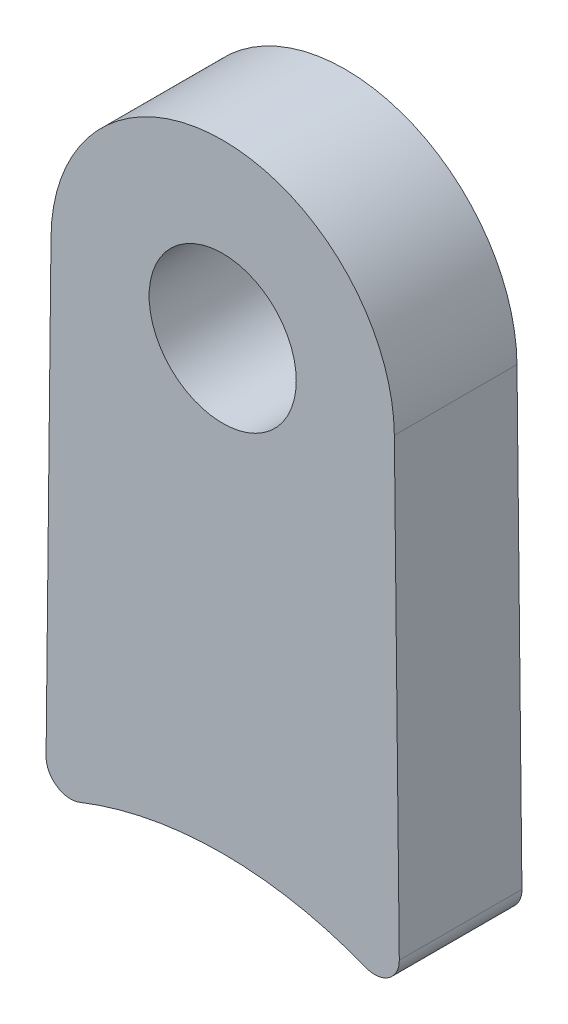
ISO-10303-21;
HEADER;
FILE_DESCRIPTION(('STEP AP214'),'2;1');
FILE_NAME('part.step','',(''),(''),'','','');
FILE_SCHEMA(('AUTOMOTIVE_DESIGN { 1 0 10303 214 1 1 1 1 }'));
ENDSEC;
DATA;
#1=APPLICATION_CONTEXT('core data for automotive mechanical design processes');
#2=APPLICATION_PROTOCOL_DEFINITION('international standard','automotive_design',2000,#1);
#3=PRODUCT_CONTEXT('',#1,'mechanical');
#4=PRODUCT('Part','Part','',(#3));
#5=PRODUCT_RELATED_PRODUCT_CATEGORY('part','',(#4));
#6=PRODUCT_DEFINITION_FORMATION('','',#4);
#7=PRODUCT_DEFINITION_CONTEXT('part definition',#1,'design');
#8=PRODUCT_DEFINITION('design','',#6,#7);
#9=PRODUCT_DEFINITION_SHAPE('','',#8);
#10=(LENGTH_UNIT() NAMED_UNIT(*) SI_UNIT(.MILLI.,.METRE.));
#11=(NAMED_UNIT(*) PLANE_ANGLE_UNIT() SI_UNIT($,.RADIAN.));
#12=(NAMED_UNIT(*) SI_UNIT($,.STERADIAN.) SOLID_ANGLE_UNIT());
#13=UNCERTAINTY_MEASURE_WITH_UNIT(LENGTH_MEASURE(1.E-05),#10,'distance_accuracy_value','');
#14=(GEOMETRIC_REPRESENTATION_CONTEXT(3) GLOBAL_UNCERTAINTY_ASSIGNED_CONTEXT((#13)) GLOBAL_UNIT_ASSIGNED_CONTEXT((#10,
#11,#12)) REPRESENTATION_CONTEXT('',''));
#15=CARTESIAN_POINT('',(0.,0.,0.));
#16=DIRECTION('',(0.,0.,1.));
#17=DIRECTION('',(1.,0.,0.));
#18=AXIS2_PLACEMENT_3D('',#15,#16,#17);
#19=CARTESIAN_POINT('',(0.,0.,5.));
#20=DIRECTION('',(0.,0.,-1.));
#21=DIRECTION('',(-1.,0.,0.));
#22=AXIS2_PLACEMENT_3D('',#19,#20,#21);
#23=PLANE('',#22);
#24=CARTESIAN_POINT('',(0.,0.,5.));
#25=DIRECTION('',(0.,0.,-1.));
#26=DIRECTION('',(-1.,0.,0.));
#27=AXIS2_PLACEMENT_3D('',#24,#25,#26);
#28=CIRCLE('',#27,15.875);
#29=CARTESIAN_POINT('',(-5.83330563587867,14.764422452586,5.));
#30=VERTEX_POINT('',#29);
#31=CARTESIAN_POINT('',(5.83330563587867,14.764422452586,5.));
#32=VERTEX_POINT('',#31);
#33=EDGE_CURVE('E98',#30,#32,#28,.T.);
#34=ORIENTED_EDGE('',*,*,#33,.T.);
#35=CARTESIAN_POINT('',(6.20075795939859,15.694464811804,5.));
#36=DIRECTION('',(0.,0.,-1.));
#37=DIRECTION('',(-1.,0.,0.));
#38=AXIS2_PLACEMENT_3D('',#35,#36,#37);
#39=CIRCLE('',#38,1.);
#40=CARTESIAN_POINT('',(7.20069844227999,15.7053749307274,5.));
#41=VERTEX_POINT('',#40);
#42=EDGE_CURVE('E42',#32,#41,#39,.F.);
#43=ORIENTED_EDGE('',*,*,#42,.T.);
#44=DIRECTION('',(-0.010910118923341,0.999940482881396,0.));
#45=VECTOR('',#44,1.);
#46=CARTESIAN_POINT('',(7.21778575863659,14.1392784024653,5.));
#47=LINE('',#46,#45);
#48=CARTESIAN_POINT('',(6.99958338016977,34.1380880600933,5.));
#49=VERTEX_POINT('',#48);
#50=EDGE_CURVE('E88',#41,#49,#47,.T.);
#51=ORIENTED_EDGE('',*,*,#50,.T.);
#52=CARTESIAN_POINT('',(0.,34.0617172276299,5.));
#53=DIRECTION('',(0.,0.,1.));
#54=DIRECTION('',(-1.,0.,0.));
#55=AXIS2_PLACEMENT_3D('',#52,#53,#54);
#56=CIRCLE('',#55,7.);
#57=CARTESIAN_POINT('',(-6.99958338016977,34.1380880600933,5.));
#58=VERTEX_POINT('',#57);
#59=EDGE_CURVE('E92',#49,#58,#56,.T.);
#60=ORIENTED_EDGE('',*,*,#59,.T.);
#61=DIRECTION('',(-0.010910118923341,-0.999940482881396,0.));
#62=VECTOR('',#61,1.);
#63=CARTESIAN_POINT('',(-7.21778575863659,14.1392784024653,5.));
#64=LINE('',#63,#62);
#65=CARTESIAN_POINT('',(-7.20069844227999,15.7053749307274,5.));
#66=VERTEX_POINT('',#65);
#67=EDGE_CURVE('E112',#58,#66,#64,.T.);
#68=ORIENTED_EDGE('',*,*,#67,.T.);
#69=CARTESIAN_POINT('',(-6.20075795939859,15.694464811804,5.));
#70=DIRECTION('',(0.,0.,-1.));
#71=DIRECTION('',(-1.,0.,0.));
#72=AXIS2_PLACEMENT_3D('',#69,#70,#71);
#73=CIRCLE('',#72,1.);
#74=EDGE_CURVE('E135',#66,#30,#73,.F.);
#75=ORIENTED_EDGE('',*,*,#74,.T.);
#76=EDGE_LOOP('',(#34,#43,#51,#60,#68,#75));
#77=FACE_BOUND('',#76,.T.);
#78=CARTESIAN_POINT('',(0.,34.0617172276299,5.));
#79=DIRECTION('',(0.,0.,1.));
#80=DIRECTION('',(1.,0.,0.));
#81=AXIS2_PLACEMENT_3D('',#78,#79,#80);
#82=CIRCLE('',#81,3.);
#83=CARTESIAN_POINT('',(3.,34.0617172276299,5.));
#84=VERTEX_POINT('',#83);
#85=EDGE_CURVE('E119',#84,#84,#82,.T.);
#86=ORIENTED_EDGE('',*,*,#85,.F.);
#87=EDGE_LOOP('',(#86));
#88=FACE_BOUND('',#87,.T.);
#89=ADVANCED_FACE('F34',(#77,#88),#23,.F.);
#90=CARTESIAN_POINT('',(0.,0.,0.));
#91=DIRECTION('',(0.,0.,-1.));
#92=DIRECTION('',(-1.,0.,0.));
#93=AXIS2_PLACEMENT_3D('',#90,#91,#92);
#94=PLANE('',#93);
#95=DIRECTION('',(-0.010910118923341,0.999940482881396,0.));
#96=VECTOR('',#95,1.);
#97=CARTESIAN_POINT('',(7.21778575863659,14.1392784024653,0.));
#98=LINE('',#97,#96);
#99=CARTESIAN_POINT('',(7.20069844227999,15.7053749307274,0.));
#100=VERTEX_POINT('',#99);
#101=CARTESIAN_POINT('',(6.99958338016977,34.1380880600933,0.));
#102=VERTEX_POINT('',#101);
#103=EDGE_CURVE('E104',#100,#102,#98,.T.);
#104=ORIENTED_EDGE('',*,*,#103,.F.);
#105=CARTESIAN_POINT('',(6.20075795939859,15.694464811804,0.));
#106=DIRECTION('',(0.,0.,-1.));
#107=DIRECTION('',(-1.,0.,0.));
#108=AXIS2_PLACEMENT_3D('',#105,#106,#107);
#109=CIRCLE('',#108,1.);
#110=CARTESIAN_POINT('',(5.83330563587867,14.764422452586,0.));
#111=VERTEX_POINT('',#110);
#112=EDGE_CURVE('E129',#100,#111,#109,.T.);
#113=ORIENTED_EDGE('',*,*,#112,.T.);
#114=CARTESIAN_POINT('',(0.,0.,0.));
#115=DIRECTION('',(0.,0.,-1.));
#116=DIRECTION('',(-1.,0.,0.));
#117=AXIS2_PLACEMENT_3D('',#114,#115,#116);
#118=CIRCLE('',#117,15.875);
#119=CARTESIAN_POINT('',(-5.83330563587867,14.764422452586,0.));
#120=VERTEX_POINT('',#119);
#121=EDGE_CURVE('E117',#120,#111,#118,.T.);
#122=ORIENTED_EDGE('',*,*,#121,.F.);
#123=CARTESIAN_POINT('',(-6.20075795939859,15.694464811804,0.));
#124=DIRECTION('',(0.,0.,-1.));
#125=DIRECTION('',(-1.,0.,0.));
#126=AXIS2_PLACEMENT_3D('',#123,#124,#125);
#127=CIRCLE('',#126,1.);
#128=CARTESIAN_POINT('',(-7.20069844227999,15.7053749307274,0.));
#129=VERTEX_POINT('',#128);
#130=EDGE_CURVE('E127',#120,#129,#127,.T.);
#131=ORIENTED_EDGE('',*,*,#130,.T.);
#132=DIRECTION('',(-0.010910118923341,-0.999940482881396,0.));
#133=VECTOR('',#132,1.);
#134=CARTESIAN_POINT('',(-7.21778575863659,14.1392784024653,0.));
#135=LINE('',#134,#133);
#136=CARTESIAN_POINT('',(-6.99958338016977,34.1380880600933,0.));
#137=VERTEX_POINT('',#136);
#138=EDGE_CURVE('E123',#137,#129,#135,.T.);
#139=ORIENTED_EDGE('',*,*,#138,.F.);
#140=CARTESIAN_POINT('',(0.,34.0617172276299,0.));
#141=DIRECTION('',(0.,0.,1.));
#142=DIRECTION('',(-1.,0.,0.));
#143=AXIS2_PLACEMENT_3D('',#140,#141,#142);
#144=CIRCLE('',#143,7.);
#145=EDGE_CURVE('E121',#102,#137,#144,.T.);
#146=ORIENTED_EDGE('',*,*,#145,.F.);
#147=EDGE_LOOP('',(#104,#113,#122,#131,#139,#146));
#148=FACE_BOUND('',#147,.T.);
#149=CARTESIAN_POINT('',(0.,34.0617172276299,0.));
#150=DIRECTION('',(0.,0.,1.));
#151=DIRECTION('',(1.,0.,0.));
#152=AXIS2_PLACEMENT_3D('',#149,#150,#151);
#153=CIRCLE('',#152,3.);
#154=CARTESIAN_POINT('',(3.,34.0617172276299,0.));
#155=VERTEX_POINT('',#154);
#156=EDGE_CURVE('E225',#155,#155,#153,.T.);
#157=ORIENTED_EDGE('',*,*,#156,.T.);
#158=EDGE_LOOP('',(#157));
#159=FACE_BOUND('',#158,.T.);
#160=ADVANCED_FACE('F143',(#148,#159),#94,.T.);
#161=CARTESIAN_POINT('',(0.,0.,5.));
#162=DIRECTION('',(0.,0.,-1.));
#163=DIRECTION('',(-1.,0.,0.));
#164=AXIS2_PLACEMENT_3D('',#161,#162,#163);
#165=CYLINDRICAL_SURFACE('',#164,15.875);
#166=ORIENTED_EDGE('',*,*,#121,.T.);
#167=DIRECTION('',(0.,0.,-1.));
#168=VECTOR('',#167,1.);
#169=CARTESIAN_POINT('',(5.83330563587867,14.764422452586,5.));
#170=LINE('',#169,#168);
#171=EDGE_CURVE('E55',#111,#32,#170,.F.);
#172=ORIENTED_EDGE('',*,*,#171,.T.);
#173=ORIENTED_EDGE('',*,*,#33,.F.);
#174=DIRECTION('',(0.,0.,-1.));
#175=VECTOR('',#174,1.);
#176=CARTESIAN_POINT('',(-5.83330563587867,14.764422452586,5.));
#177=LINE('',#176,#175);
#178=EDGE_CURVE('E131',#30,#120,#177,.T.);
#179=ORIENTED_EDGE('',*,*,#178,.T.);
#180=EDGE_LOOP('',(#166,#172,#173,#179));
#181=FACE_BOUND('',#180,.T.);
#182=ADVANCED_FACE('F139',(#181),#165,.F.);
#183=CARTESIAN_POINT('',(7.21778575863659,14.1392784024653,5.));
#184=DIRECTION('',(-0.999940482881396,-0.010910118923341,0.));
#185=DIRECTION('',(0.010910118923341,-0.999940482881396,0.));
#186=AXIS2_PLACEMENT_3D('',#183,#184,#185);
#187=PLANE('',#186);
#188=ORIENTED_EDGE('',*,*,#50,.F.);
#189=DIRECTION('',(0.,0.,-1.));
#190=VECTOR('',#189,1.);
#191=CARTESIAN_POINT('',(7.20069844227999,15.7053749307274,5.));
#192=LINE('',#191,#190);
#193=EDGE_CURVE('E107',#41,#100,#192,.T.);
#194=ORIENTED_EDGE('',*,*,#193,.T.);
#195=ORIENTED_EDGE('',*,*,#103,.T.);
#196=DIRECTION('',(0.,0.,-1.));
#197=VECTOR('',#196,1.);
#198=CARTESIAN_POINT('',(6.99958338016977,34.1380880600933,5.));
#199=LINE('',#198,#197);
#200=EDGE_CURVE('E101',#49,#102,#199,.T.);
#201=ORIENTED_EDGE('',*,*,#200,.F.);
#202=EDGE_LOOP('',(#188,#194,#195,#201));
#203=FACE_BOUND('',#202,.T.);
#204=ADVANCED_FACE('F102',(#203),#187,.F.);
#205=CARTESIAN_POINT('',(0.,34.0617172276299,5.));
#206=DIRECTION('',(0.,0.,-1.));
#207=DIRECTION('',(-1.,0.,0.));
#208=AXIS2_PLACEMENT_3D('',#205,#206,#207);
#209=CYLINDRICAL_SURFACE('',#208,7.);
#210=ORIENTED_EDGE('',*,*,#145,.T.);
#211=DIRECTION('',(0.,0.,-1.));
#212=VECTOR('',#211,1.);
#213=CARTESIAN_POINT('',(-6.99958338016977,34.1380880600933,5.));
#214=LINE('',#213,#212);
#215=EDGE_CURVE('E108',#58,#137,#214,.T.);
#216=ORIENTED_EDGE('',*,*,#215,.F.);
#217=ORIENTED_EDGE('',*,*,#59,.F.);
#218=ORIENTED_EDGE('',*,*,#200,.T.);
#219=EDGE_LOOP('',(#210,#216,#217,#218));
#220=FACE_BOUND('',#219,.T.);
#221=ADVANCED_FACE('F110',(#220),#209,.T.);
#222=CARTESIAN_POINT('',(-7.21778575863659,14.1392784024653,5.));
#223=DIRECTION('',(0.999940482881396,-0.010910118923341,0.));
#224=DIRECTION('',(0.010910118923341,0.999940482881396,0.));
#225=AXIS2_PLACEMENT_3D('',#222,#223,#224);
#226=PLANE('',#225);
#227=ORIENTED_EDGE('',*,*,#138,.T.);
#228=DIRECTION('',(0.,0.,-1.));
#229=VECTOR('',#228,1.);
#230=CARTESIAN_POINT('',(-7.20069844227999,15.7053749307274,5.));
#231=LINE('',#230,#229);
#232=EDGE_CURVE('E11',#129,#66,#231,.F.);
#233=ORIENTED_EDGE('',*,*,#232,.T.);
#234=ORIENTED_EDGE('',*,*,#67,.F.);
#235=ORIENTED_EDGE('',*,*,#215,.T.);
#236=EDGE_LOOP('',(#227,#233,#234,#235));
#237=FACE_BOUND('',#236,.T.);
#238=ADVANCED_FACE('F145',(#237),#226,.F.);
#239=CARTESIAN_POINT('',(0.,34.0617172276299,5.));
#240=DIRECTION('',(0.,0.,-1.));
#241=DIRECTION('',(-1.,0.,0.));
#242=AXIS2_PLACEMENT_3D('',#239,#240,#241);
#243=CYLINDRICAL_SURFACE('',#242,3.);
#244=ORIENTED_EDGE('',*,*,#85,.T.);
#245=EDGE_LOOP('',(#244));
#246=FACE_BOUND('',#245,.T.);
#247=ORIENTED_EDGE('',*,*,#156,.F.);
#248=EDGE_LOOP('',(#247));
#249=FACE_BOUND('',#248,.T.);
#250=ADVANCED_FACE('F147',(#246,#249),#243,.F.);
#251=CARTESIAN_POINT('',(6.20075795939859,15.694464811804,5.));
#252=DIRECTION('',(0.,0.,-1.));
#253=DIRECTION('',(-1.,0.,0.));
#254=AXIS2_PLACEMENT_3D('',#251,#252,#253);
#255=CYLINDRICAL_SURFACE('',#254,1.);
#256=ORIENTED_EDGE('',*,*,#42,.F.);
#257=ORIENTED_EDGE('',*,*,#171,.F.);
#258=ORIENTED_EDGE('',*,*,#112,.F.);
#259=ORIENTED_EDGE('',*,*,#193,.F.);
#260=EDGE_LOOP('',(#256,#257,#258,#259));
#261=FACE_BOUND('',#260,.T.);
#262=ADVANCED_FACE('F153',(#261),#255,.T.);
#263=CARTESIAN_POINT('',(-6.20075795939859,15.694464811804,5.));
#264=DIRECTION('',(0.,0.,-1.));
#265=DIRECTION('',(-1.,0.,0.));
#266=AXIS2_PLACEMENT_3D('',#263,#264,#265);
#267=CYLINDRICAL_SURFACE('',#266,1.);
#268=ORIENTED_EDGE('',*,*,#74,.F.);
#269=ORIENTED_EDGE('',*,*,#232,.F.);
#270=ORIENTED_EDGE('',*,*,#130,.F.);
#271=ORIENTED_EDGE('',*,*,#178,.F.);
#272=EDGE_LOOP('',(#268,#269,#270,#271));
#273=FACE_BOUND('',#272,.T.);
#274=ADVANCED_FACE('F36',(#273),#267,.T.);
#275=CLOSED_SHELL('',(#89,#160,#182,#204,#221,#238,#250,#262,#274));
#276=MANIFOLD_SOLID_BREP('B2',#275);
#277=ADVANCED_BREP_SHAPE_REPRESENTATION('',(#18,#276),#14);
#278=SHAPE_DEFINITION_REPRESENTATION(#9,#277);
ENDSEC;
END-ISO-10303-21;
